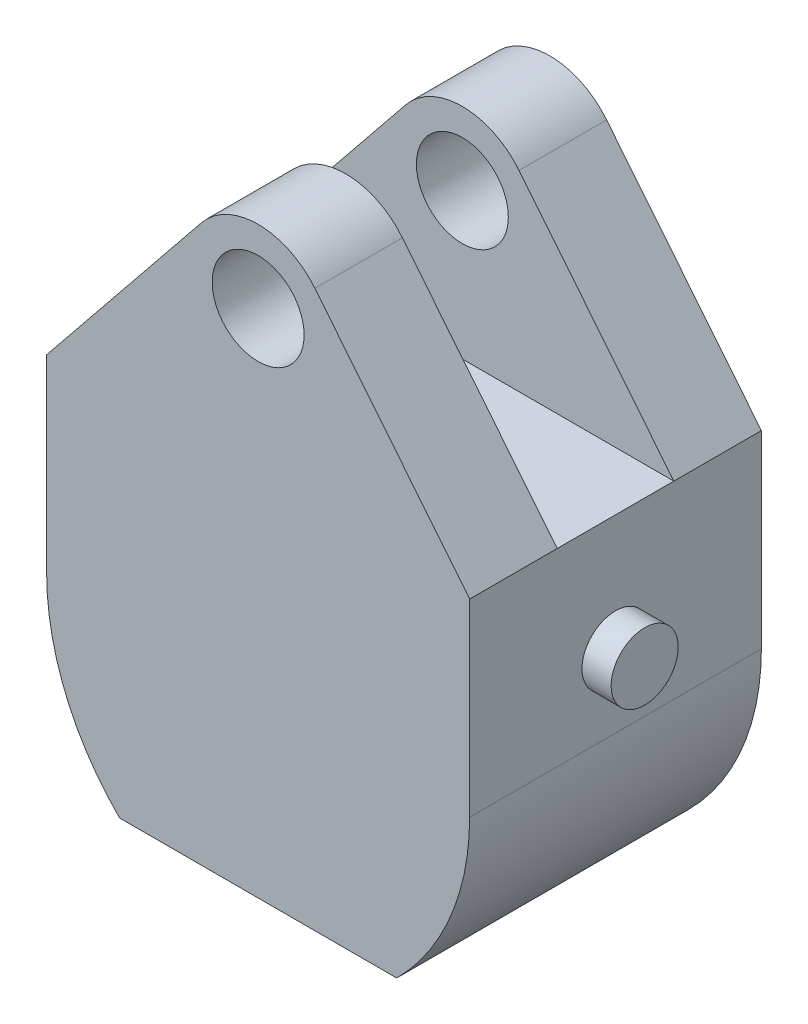
ISO-10303-21;
HEADER;
FILE_DESCRIPTION(('STEP AP214'),'2;1');
FILE_NAME('part.step','',(''),(''),'','','');
FILE_SCHEMA(('AUTOMOTIVE_DESIGN { 1 0 10303 214 1 1 1 1 }'));
ENDSEC;
DATA;
#1=APPLICATION_CONTEXT('core data for automotive mechanical design processes');
#2=APPLICATION_PROTOCOL_DEFINITION('international standard','automotive_design',2000,#1);
#3=PRODUCT_CONTEXT('',#1,'mechanical');
#4=PRODUCT('Part','Part','',(#3));
#5=PRODUCT_RELATED_PRODUCT_CATEGORY('part','',(#4));
#6=PRODUCT_DEFINITION_FORMATION('','',#4);
#7=PRODUCT_DEFINITION_CONTEXT('part definition',#1,'design');
#8=PRODUCT_DEFINITION('design','',#6,#7);
#9=PRODUCT_DEFINITION_SHAPE('','',#8);
#10=(LENGTH_UNIT() NAMED_UNIT(*) SI_UNIT(.MILLI.,.METRE.));
#11=(NAMED_UNIT(*) PLANE_ANGLE_UNIT() SI_UNIT($,.RADIAN.));
#12=(NAMED_UNIT(*) SI_UNIT($,.STERADIAN.) SOLID_ANGLE_UNIT());
#13=UNCERTAINTY_MEASURE_WITH_UNIT(LENGTH_MEASURE(1.E-05),#10,'distance_accuracy_value','');
#14=(GEOMETRIC_REPRESENTATION_CONTEXT(3) GLOBAL_UNCERTAINTY_ASSIGNED_CONTEXT((#13)) GLOBAL_UNIT_ASSIGNED_CONTEXT((#10,
#11,#12)) REPRESENTATION_CONTEXT('',''));
#15=CARTESIAN_POINT('',(0.,0.,0.));
#16=DIRECTION('',(0.,0.,1.));
#17=DIRECTION('',(1.,0.,0.));
#18=AXIS2_PLACEMENT_3D('',#15,#16,#17);
#19=CARTESIAN_POINT('',(0.,0.,20.));
#20=DIRECTION('',(0.,0.,1.));
#21=DIRECTION('',(1.,0.,0.));
#22=AXIS2_PLACEMENT_3D('',#19,#20,#21);
#23=PLANE('',#22);
#24=CARTESIAN_POINT('',(14.5,-5.,20.));
#25=DIRECTION('',(0.,0.,1.));
#26=DIRECTION('',(1.,0.,0.));
#27=AXIS2_PLACEMENT_3D('',#24,#25,#26);
#28=CIRCLE('',#27,3.15);
#29=CARTESIAN_POINT('',(17.65,-5.,20.));
#30=VERTEX_POINT('',#29);
#31=EDGE_CURVE('E338',#30,#30,#28,.T.);
#32=ORIENTED_EDGE('',*,*,#31,.F.);
#33=EDGE_LOOP('',(#32));
#34=FACE_BOUND('',#33,.T.);
#35=DIRECTION('',(0.,-1.,0.));
#36=VECTOR('',#35,1.);
#37=CARTESIAN_POINT('',(0.,0.,20.));
#38=LINE('',#37,#36);
#39=CARTESIAN_POINT('',(0.,-15.,20.));
#40=VERTEX_POINT('',#39);
#41=CARTESIAN_POINT('',(0.,-27.9583694396574,20.));
#42=VERTEX_POINT('',#41);
#43=EDGE_CURVE('E277',#40,#42,#38,.T.);
#44=ORIENTED_EDGE('',*,*,#43,.T.);
#45=CARTESIAN_POINT('',(17.,-27.9583694396574,20.));
#46=DIRECTION('',(0.,0.,1.));
#47=DIRECTION('',(1.,0.,0.));
#48=AXIS2_PLACEMENT_3D('',#45,#46,#47);
#49=CIRCLE('',#48,17.);
#50=CARTESIAN_POINT('',(4.9791847198287,-39.9791847198287,20.));
#51=VERTEX_POINT('',#50);
#52=EDGE_CURVE('E317',#42,#51,#49,.T.);
#53=ORIENTED_EDGE('',*,*,#52,.T.);
#54=DIRECTION('',(0.707106781186548,-0.707106781186547,0.));
#55=VECTOR('',#54,1.);
#56=CARTESIAN_POINT('',(-17.5,-17.5,20.));
#57=LINE('',#56,#55);
#58=CARTESIAN_POINT('',(5.00000000000002,-40.,20.));
#59=VERTEX_POINT('',#58);
#60=EDGE_CURVE('E194',#51,#59,#57,.T.);
#61=ORIENTED_EDGE('',*,*,#60,.T.);
#62=DIRECTION('',(1.,0.,0.));
#63=VECTOR('',#62,1.);
#64=CARTESIAN_POINT('',(0.,-40.,20.));
#65=LINE('',#64,#63);
#66=CARTESIAN_POINT('',(24.,-40.,20.));
#67=VERTEX_POINT('',#66);
#68=EDGE_CURVE('E280',#59,#67,#65,.T.);
#69=ORIENTED_EDGE('',*,*,#68,.T.);
#70=DIRECTION('',(-0.707106781186548,-0.707106781186547,0.));
#71=VECTOR('',#70,1.);
#72=CARTESIAN_POINT('',(32.,-32.,20.));
#73=LINE('',#72,#71);
#74=CARTESIAN_POINT('',(24.0208152801713,-39.9791847198287,20.));
#75=VERTEX_POINT('',#74);
#76=EDGE_CURVE('E210',#75,#67,#73,.T.);
#77=ORIENTED_EDGE('',*,*,#76,.F.);
#78=CARTESIAN_POINT('',(12.,-27.9583694396574,20.));
#79=DIRECTION('',(0.,0.,1.));
#80=DIRECTION('',(1.,0.,0.));
#81=AXIS2_PLACEMENT_3D('',#78,#79,#80);
#82=CIRCLE('',#81,17.);
#83=CARTESIAN_POINT('',(29.,-27.9583694396574,20.));
#84=VERTEX_POINT('',#83);
#85=EDGE_CURVE('E314',#75,#84,#82,.T.);
#86=ORIENTED_EDGE('',*,*,#85,.T.);
#87=DIRECTION('',(0.,1.,0.));
#88=VECTOR('',#87,1.);
#89=CARTESIAN_POINT('',(29.,0.,20.));
#90=LINE('',#89,#88);
#91=CARTESIAN_POINT('',(29.,-15.,20.));
#92=VERTEX_POINT('',#91);
#93=EDGE_CURVE('E285',#84,#92,#90,.T.);
#94=ORIENTED_EDGE('',*,*,#93,.T.);
#95=DIRECTION('',(-0.628188600914717,0.778061104079115,0.));
#96=VECTOR('',#95,1.);
#97=CARTESIAN_POINT('',(10.2244566227792,8.25499060074311,20.));
#98=LINE('',#97,#96);
#99=CARTESIAN_POINT('',(18.3903055203956,-1.85905699542642,20.));
#100=VERTEX_POINT('',#99);
#101=EDGE_CURVE('E179',#92,#100,#98,.T.);
#102=ORIENTED_EDGE('',*,*,#101,.T.);
#103=CARTESIAN_POINT('',(14.5,-5.,20.));
#104=DIRECTION('',(0.,0.,1.));
#105=DIRECTION('',(1.,0.,0.));
#106=AXIS2_PLACEMENT_3D('',#103,#104,#105);
#107=CIRCLE('',#106,5.);
#108=CARTESIAN_POINT('',(10.6096944796044,-1.85905699542642,20.));
#109=VERTEX_POINT('',#108);
#110=EDGE_CURVE('E172',#100,#109,#107,.T.);
#111=ORIENTED_EDGE('',*,*,#110,.T.);
#112=DIRECTION('',(0.628188600914716,0.778061104079115,0.));
#113=VECTOR('',#112,1.);
#114=CARTESIAN_POINT('',(7.33153674596428,-5.91931377478783,20.));
#115=LINE('',#114,#113);
#116=EDGE_CURVE('E176',#40,#109,#115,.T.);
#117=ORIENTED_EDGE('',*,*,#116,.F.);
#118=EDGE_LOOP('',(#44,#53,#61,#69,#77,#86,#94,#102,#111,#117));
#119=FACE_BOUND('',#118,.T.);
#120=ADVANCED_FACE('F69',(#34,#119),#23,.T.);
#121=CARTESIAN_POINT('',(0.,0.,0.));
#122=DIRECTION('',(0.,0.,1.));
#123=DIRECTION('',(1.,0.,0.));
#124=AXIS2_PLACEMENT_3D('',#121,#122,#123);
#125=PLANE('',#124);
#126=CARTESIAN_POINT('',(14.5,-5.,0.));
#127=DIRECTION('',(0.,0.,1.));
#128=DIRECTION('',(1.,0.,0.));
#129=AXIS2_PLACEMENT_3D('',#126,#127,#128);
#130=CIRCLE('',#129,3.15);
#131=CARTESIAN_POINT('',(17.65,-5.,0.));
#132=VERTEX_POINT('',#131);
#133=EDGE_CURVE('E183',#132,#132,#130,.T.);
#134=ORIENTED_EDGE('',*,*,#133,.T.);
#135=EDGE_LOOP('',(#134));
#136=FACE_BOUND('',#135,.T.);
#137=DIRECTION('',(0.707106781186548,-0.707106781186547,0.));
#138=VECTOR('',#137,1.);
#139=CARTESIAN_POINT('',(-17.5,-17.5,0.));
#140=LINE('',#139,#138);
#141=CARTESIAN_POINT('',(4.97918471982871,-39.9791847198287,0.));
#142=VERTEX_POINT('',#141);
#143=CARTESIAN_POINT('',(5.00000000000001,-40.,0.));
#144=VERTEX_POINT('',#143);
#145=EDGE_CURVE('E219',#142,#144,#140,.T.);
#146=ORIENTED_EDGE('',*,*,#145,.F.);
#147=CARTESIAN_POINT('',(17.,-27.9583694396574,0.));
#148=DIRECTION('',(0.,0.,1.));
#149=DIRECTION('',(1.,0.,0.));
#150=AXIS2_PLACEMENT_3D('',#147,#148,#149);
#151=CIRCLE('',#150,17.);
#152=CARTESIAN_POINT('',(0.,-27.9583694396574,0.));
#153=VERTEX_POINT('',#152);
#154=EDGE_CURVE('E325',#142,#153,#151,.F.);
#155=ORIENTED_EDGE('',*,*,#154,.T.);
#156=DIRECTION('',(0.,-1.,0.));
#157=VECTOR('',#156,1.);
#158=CARTESIAN_POINT('',(0.,0.,0.));
#159=LINE('',#158,#157);
#160=CARTESIAN_POINT('',(0.,-15.,0.));
#161=VERTEX_POINT('',#160);
#162=EDGE_CURVE('E276',#161,#153,#159,.T.);
#163=ORIENTED_EDGE('',*,*,#162,.F.);
#164=DIRECTION('',(0.628188600914716,0.778061104079115,0.));
#165=VECTOR('',#164,1.);
#166=CARTESIAN_POINT('',(7.33153674596428,-5.91931377478783,0.));
#167=LINE('',#166,#165);
#168=CARTESIAN_POINT('',(10.6096944796044,-1.85905699542642,0.));
#169=VERTEX_POINT('',#168);
#170=EDGE_CURVE('E215',#161,#169,#167,.T.);
#171=ORIENTED_EDGE('',*,*,#170,.T.);
#172=CARTESIAN_POINT('',(14.5,-5.,0.));
#173=DIRECTION('',(0.,0.,1.));
#174=DIRECTION('',(1.,0.,0.));
#175=AXIS2_PLACEMENT_3D('',#172,#173,#174);
#176=CIRCLE('',#175,5.);
#177=CARTESIAN_POINT('',(18.3903055203956,-1.85905699542642,0.));
#178=VERTEX_POINT('',#177);
#179=EDGE_CURVE('E257',#178,#169,#176,.T.);
#180=ORIENTED_EDGE('',*,*,#179,.F.);
#181=DIRECTION('',(-0.628188600914717,0.778061104079115,0.));
#182=VECTOR('',#181,1.);
#183=CARTESIAN_POINT('',(10.2244566227792,8.25499060074311,0.));
#184=LINE('',#183,#182);
#185=CARTESIAN_POINT('',(29.,-15.,0.));
#186=VERTEX_POINT('',#185);
#187=EDGE_CURVE('E250',#186,#178,#184,.T.);
#188=ORIENTED_EDGE('',*,*,#187,.F.);
#189=DIRECTION('',(0.,1.,0.));
#190=VECTOR('',#189,1.);
#191=CARTESIAN_POINT('',(29.,0.,0.));
#192=LINE('',#191,#190);
#193=CARTESIAN_POINT('',(29.,-27.9583694396574,0.));
#194=VERTEX_POINT('',#193);
#195=EDGE_CURVE('E281',#194,#186,#192,.T.);
#196=ORIENTED_EDGE('',*,*,#195,.F.);
#197=CARTESIAN_POINT('',(12.,-27.9583694396574,0.));
#198=DIRECTION('',(0.,0.,1.));
#199=DIRECTION('',(1.,0.,0.));
#200=AXIS2_PLACEMENT_3D('',#197,#198,#199);
#201=CIRCLE('',#200,17.);
#202=CARTESIAN_POINT('',(24.0208152801713,-39.9791847198287,0.));
#203=VERTEX_POINT('',#202);
#204=EDGE_CURVE('E86',#194,#203,#201,.F.);
#205=ORIENTED_EDGE('',*,*,#204,.T.);
#206=DIRECTION('',(-0.707106781186548,-0.707106781186547,0.));
#207=VECTOR('',#206,1.);
#208=CARTESIAN_POINT('',(32.,-32.,0.));
#209=LINE('',#208,#207);
#210=CARTESIAN_POINT('',(24.,-40.,0.));
#211=VERTEX_POINT('',#210);
#212=EDGE_CURVE('E222',#203,#211,#209,.T.);
#213=ORIENTED_EDGE('',*,*,#212,.T.);
#214=DIRECTION('',(1.,0.,0.));
#215=VECTOR('',#214,1.);
#216=CARTESIAN_POINT('',(0.,-40.,0.));
#217=LINE('',#216,#215);
#218=EDGE_CURVE('E291',#144,#211,#217,.T.);
#219=ORIENTED_EDGE('',*,*,#218,.F.);
#220=EDGE_LOOP('',(#146,#155,#163,#171,#180,#188,#196,#205,#213,#219));
#221=FACE_BOUND('',#220,.T.);
#222=ADVANCED_FACE('F361',(#136,#221),#125,.F.);
#223=CARTESIAN_POINT('',(0.,-15.,6.));
#224=DIRECTION('',(0.,0.,-1.));
#225=DIRECTION('',(-1.,0.,0.));
#226=AXIS2_PLACEMENT_3D('',#223,#224,#225);
#227=PLANE('',#226);
#228=CARTESIAN_POINT('',(14.5,-5.,6.));
#229=DIRECTION('',(0.,0.,-1.));
#230=DIRECTION('',(-1.,0.,0.));
#231=AXIS2_PLACEMENT_3D('',#228,#229,#230);
#232=CIRCLE('',#231,3.15);
#233=CARTESIAN_POINT('',(11.35,-5.,6.));
#234=VERTEX_POINT('',#233);
#235=EDGE_CURVE('E226',#234,#234,#232,.T.);
#236=ORIENTED_EDGE('',*,*,#235,.T.);
#237=EDGE_LOOP('',(#236));
#238=FACE_BOUND('',#237,.T.);
#239=CARTESIAN_POINT('',(14.5,-5.,6.));
#240=DIRECTION('',(0.,0.,-1.));
#241=DIRECTION('',(-1.,0.,0.));
#242=AXIS2_PLACEMENT_3D('',#239,#240,#241);
#243=CIRCLE('',#242,5.);
#244=CARTESIAN_POINT('',(10.6096944796044,-1.85905699542642,6.));
#245=VERTEX_POINT('',#244);
#246=CARTESIAN_POINT('',(18.3903055203956,-1.85905699542642,6.));
#247=VERTEX_POINT('',#246);
#248=EDGE_CURVE('E253',#245,#247,#243,.T.);
#249=ORIENTED_EDGE('',*,*,#248,.F.);
#250=DIRECTION('',(-0.628188600914716,-0.778061104079115,0.));
#251=VECTOR('',#250,1.);
#252=CARTESIAN_POINT('',(0.,-15.,6.));
#253=LINE('',#252,#251);
#254=CARTESIAN_POINT('',(0.,-15.,6.));
#255=VERTEX_POINT('',#254);
#256=EDGE_CURVE('E205',#245,#255,#253,.T.);
#257=ORIENTED_EDGE('',*,*,#256,.T.);
#258=DIRECTION('',(-1.,0.,0.));
#259=VECTOR('',#258,1.);
#260=CARTESIAN_POINT('',(0.,-15.,6.));
#261=LINE('',#260,#259);
#262=CARTESIAN_POINT('',(29.,-15.,6.));
#263=VERTEX_POINT('',#262);
#264=EDGE_CURVE('E272',#263,#255,#261,.T.);
#265=ORIENTED_EDGE('',*,*,#264,.F.);
#266=DIRECTION('',(0.628188600914717,-0.778061104079115,0.));
#267=VECTOR('',#266,1.);
#268=CARTESIAN_POINT('',(17.5559933687435,-0.825695624469056,6.));
#269=LINE('',#268,#267);
#270=EDGE_CURVE('E247',#247,#263,#269,.T.);
#271=ORIENTED_EDGE('',*,*,#270,.F.);
#272=EDGE_LOOP('',(#249,#257,#265,#271));
#273=FACE_BOUND('',#272,.T.);
#274=ADVANCED_FACE('F397',(#238,#273),#227,.F.);
#275=CARTESIAN_POINT('',(0.,-15.,14.));
#276=DIRECTION('',(0.,0.,1.));
#277=DIRECTION('',(1.,0.,0.));
#278=AXIS2_PLACEMENT_3D('',#275,#276,#277);
#279=PLANE('',#278);
#280=CARTESIAN_POINT('',(14.5,-5.,14.));
#281=DIRECTION('',(0.,0.,1.));
#282=DIRECTION('',(1.,0.,0.));
#283=AXIS2_PLACEMENT_3D('',#280,#281,#282);
#284=CIRCLE('',#283,3.15);
#285=CARTESIAN_POINT('',(17.65,-5.,14.));
#286=VERTEX_POINT('',#285);
#287=EDGE_CURVE('E225',#286,#286,#284,.T.);
#288=ORIENTED_EDGE('',*,*,#287,.T.);
#289=EDGE_LOOP('',(#288));
#290=FACE_BOUND('',#289,.T.);
#291=DIRECTION('',(0.628188600914716,0.778061104079115,0.));
#292=VECTOR('',#291,1.);
#293=CARTESIAN_POINT('',(0.,-15.,14.));
#294=LINE('',#293,#292);
#295=CARTESIAN_POINT('',(0.,-15.,14.));
#296=VERTEX_POINT('',#295);
#297=CARTESIAN_POINT('',(10.6096944796044,-1.85905699542642,14.));
#298=VERTEX_POINT('',#297);
#299=EDGE_CURVE('E200',#296,#298,#294,.T.);
#300=ORIENTED_EDGE('',*,*,#299,.T.);
#301=CARTESIAN_POINT('',(14.5,-5.,14.));
#302=DIRECTION('',(0.,0.,1.));
#303=DIRECTION('',(1.,0.,0.));
#304=AXIS2_PLACEMENT_3D('',#301,#302,#303);
#305=CIRCLE('',#304,5.);
#306=CARTESIAN_POINT('',(18.3903055203956,-1.85905699542642,14.));
#307=VERTEX_POINT('',#306);
#308=EDGE_CURVE('E189',#307,#298,#305,.T.);
#309=ORIENTED_EDGE('',*,*,#308,.F.);
#310=DIRECTION('',(-0.628188600914717,0.778061104079115,0.));
#311=VECTOR('',#310,1.);
#312=CARTESIAN_POINT('',(17.5559933687435,-0.825695624469056,14.));
#313=LINE('',#312,#311);
#314=CARTESIAN_POINT('',(29.,-15.,14.));
#315=VERTEX_POINT('',#314);
#316=EDGE_CURVE('E244',#315,#307,#313,.T.);
#317=ORIENTED_EDGE('',*,*,#316,.F.);
#318=DIRECTION('',(1.,0.,0.));
#319=VECTOR('',#318,1.);
#320=CARTESIAN_POINT('',(0.,-15.,14.));
#321=LINE('',#320,#319);
#322=EDGE_CURVE('E264',#296,#315,#321,.T.);
#323=ORIENTED_EDGE('',*,*,#322,.F.);
#324=EDGE_LOOP('',(#300,#309,#317,#323));
#325=FACE_BOUND('',#324,.T.);
#326=ADVANCED_FACE('F388',(#290,#325),#279,.F.);
#327=CARTESIAN_POINT('',(0.,0.,20.));
#328=DIRECTION('',(1.,0.,0.));
#329=DIRECTION('',(0.,1.,0.));
#330=AXIS2_PLACEMENT_3D('',#327,#328,#329);
#331=PLANE('',#330);
#332=CARTESIAN_POINT('',(0.,-23.,10.));
#333=DIRECTION('',(1.,0.,0.));
#334=DIRECTION('',(0.,1.,0.));
#335=AXIS2_PLACEMENT_3D('',#332,#333,#334);
#336=CIRCLE('',#335,2.3);
#337=CARTESIAN_POINT('',(0.,-20.7,10.));
#338=VERTEX_POINT('',#337);
#339=EDGE_CURVE('E342',#338,#338,#336,.T.);
#340=ORIENTED_EDGE('',*,*,#339,.T.);
#341=EDGE_LOOP('',(#340));
#342=FACE_BOUND('',#341,.T.);
#343=ORIENTED_EDGE('',*,*,#162,.T.);
#344=DIRECTION('',(0.,0.,1.));
#345=VECTOR('',#344,1.);
#346=CARTESIAN_POINT('',(0.,-27.9583694396574,20.));
#347=LINE('',#346,#345);
#348=EDGE_CURVE('E307',#153,#42,#347,.T.);
#349=ORIENTED_EDGE('',*,*,#348,.T.);
#350=ORIENTED_EDGE('',*,*,#43,.F.);
#351=DIRECTION('',(0.,0.,1.));
#352=VECTOR('',#351,1.);
#353=CARTESIAN_POINT('',(0.,-15.,-10.));
#354=LINE('',#353,#352);
#355=EDGE_CURVE('E198',#296,#40,#354,.T.);
#356=ORIENTED_EDGE('',*,*,#355,.F.);
#357=DIRECTION('',(0.,0.,1.));
#358=VECTOR('',#357,1.);
#359=CARTESIAN_POINT('',(0.,-15.,6.));
#360=LINE('',#359,#358);
#361=EDGE_CURVE('E260',#255,#296,#360,.T.);
#362=ORIENTED_EDGE('',*,*,#361,.F.);
#363=EDGE_CURVE('E201',#161,#255,#354,.T.);
#364=ORIENTED_EDGE('',*,*,#363,.F.);
#365=EDGE_LOOP('',(#343,#349,#350,#356,#362,#364));
#366=FACE_BOUND('',#365,.T.);
#367=ADVANCED_FACE('F366',(#342,#366),#331,.F.);
#368=CARTESIAN_POINT('',(0.,-40.,20.));
#369=DIRECTION('',(0.,1.,0.));
#370=DIRECTION('',(0.,0.,1.));
#371=AXIS2_PLACEMENT_3D('',#368,#369,#370);
#372=PLANE('',#371);
#373=ORIENTED_EDGE('',*,*,#218,.T.);
#374=DIRECTION('',(0.,0.,1.));
#375=VECTOR('',#374,1.);
#376=CARTESIAN_POINT('',(24.,-40.,20.));
#377=LINE('',#376,#375);
#378=EDGE_CURVE('E303',#211,#67,#377,.T.);
#379=ORIENTED_EDGE('',*,*,#378,.T.);
#380=ORIENTED_EDGE('',*,*,#68,.F.);
#381=DIRECTION('',(0.,0.,1.));
#382=VECTOR('',#381,1.);
#383=CARTESIAN_POINT('',(5.00000000000001,-40.,20.));
#384=LINE('',#383,#382);
#385=EDGE_CURVE('E299',#144,#59,#384,.T.);
#386=ORIENTED_EDGE('',*,*,#385,.F.);
#387=EDGE_LOOP('',(#373,#379,#380,#386));
#388=FACE_BOUND('',#387,.T.);
#389=ADVANCED_FACE('F377',(#388),#372,.F.);
#390=CARTESIAN_POINT('',(29.,0.,20.));
#391=DIRECTION('',(-1.,0.,0.));
#392=DIRECTION('',(0.,-1.,0.));
#393=AXIS2_PLACEMENT_3D('',#390,#391,#392);
#394=PLANE('',#393);
#395=CARTESIAN_POINT('',(29.,-23.,10.));
#396=DIRECTION('',(-1.,0.,0.));
#397=DIRECTION('',(0.,-1.,0.));
#398=AXIS2_PLACEMENT_3D('',#395,#396,#397);
#399=CIRCLE('',#398,2.3);
#400=CARTESIAN_POINT('',(29.,-25.3,10.));
#401=VERTEX_POINT('',#400);
#402=EDGE_CURVE('E73',#401,#401,#399,.T.);
#403=ORIENTED_EDGE('',*,*,#402,.T.);
#404=EDGE_LOOP('',(#403));
#405=FACE_BOUND('',#404,.T.);
#406=ORIENTED_EDGE('',*,*,#93,.F.);
#407=DIRECTION('',(0.,0.,1.));
#408=VECTOR('',#407,1.);
#409=CARTESIAN_POINT('',(29.,-27.9583694396574,20.));
#410=LINE('',#409,#408);
#411=EDGE_CURVE('E12',#84,#194,#410,.F.);
#412=ORIENTED_EDGE('',*,*,#411,.T.);
#413=ORIENTED_EDGE('',*,*,#195,.T.);
#414=DIRECTION('',(0.,0.,1.));
#415=VECTOR('',#414,1.);
#416=CARTESIAN_POINT('',(29.,-15.,-10.));
#417=LINE('',#416,#415);
#418=EDGE_CURVE('E240',#186,#263,#417,.T.);
#419=ORIENTED_EDGE('',*,*,#418,.T.);
#420=DIRECTION('',(0.,0.,-1.));
#421=VECTOR('',#420,1.);
#422=CARTESIAN_POINT('',(29.,-15.,6.));
#423=LINE('',#422,#421);
#424=EDGE_CURVE('E268',#315,#263,#423,.T.);
#425=ORIENTED_EDGE('',*,*,#424,.F.);
#426=EDGE_CURVE('E236',#315,#92,#417,.T.);
#427=ORIENTED_EDGE('',*,*,#426,.T.);
#428=EDGE_LOOP('',(#406,#412,#413,#419,#425,#427));
#429=FACE_BOUND('',#428,.T.);
#430=ADVANCED_FACE('F379',(#405,#429),#394,.F.);
#431=CARTESIAN_POINT('',(0.,-15.,0.));
#432=DIRECTION('',(0.,1.,0.));
#433=DIRECTION('',(0.,0.,1.));
#434=AXIS2_PLACEMENT_3D('',#431,#432,#433);
#435=PLANE('',#434);
#436=ORIENTED_EDGE('',*,*,#361,.T.);
#437=ORIENTED_EDGE('',*,*,#322,.T.);
#438=ORIENTED_EDGE('',*,*,#424,.T.);
#439=ORIENTED_EDGE('',*,*,#264,.T.);
#440=EDGE_LOOP('',(#436,#437,#438,#439));
#441=FACE_BOUND('',#440,.T.);
#442=ADVANCED_FACE('F385',(#441),#435,.T.);
#443=CARTESIAN_POINT('',(10.2244566227792,8.25499060074311,-10.));
#444=DIRECTION('',(0.778061104079115,0.628188600914717,0.));
#445=DIRECTION('',(-0.628188600914717,0.778061104079115,0.));
#446=AXIS2_PLACEMENT_3D('',#443,#444,#445);
#447=PLANE('',#446);
#448=ORIENTED_EDGE('',*,*,#316,.T.);
#449=DIRECTION('',(0.,0.,1.));
#450=VECTOR('',#449,1.);
#451=CARTESIAN_POINT('',(18.3903055203956,-1.85905699542642,-10.));
#452=LINE('',#451,#450);
#453=EDGE_CURVE('E235',#307,#100,#452,.T.);
#454=ORIENTED_EDGE('',*,*,#453,.T.);
#455=ORIENTED_EDGE('',*,*,#101,.F.);
#456=ORIENTED_EDGE('',*,*,#426,.F.);
#457=EDGE_LOOP('',(#448,#454,#455,#456));
#458=FACE_BOUND('',#457,.T.);
#459=ADVANCED_FACE('F410',(#458),#447,.T.);
#460=CARTESIAN_POINT('',(14.5,-5.,-10.));
#461=DIRECTION('',(0.,0.,1.));
#462=DIRECTION('',(1.,0.,0.));
#463=AXIS2_PLACEMENT_3D('',#460,#461,#462);
#464=CYLINDRICAL_SURFACE('',#463,5.);
#465=ORIENTED_EDGE('',*,*,#308,.T.);
#466=DIRECTION('',(0.,0.,1.));
#467=VECTOR('',#466,1.);
#468=CARTESIAN_POINT('',(10.6096944796044,-1.85905699542642,-10.));
#469=LINE('',#468,#467);
#470=EDGE_CURVE('E186',#298,#109,#469,.T.);
#471=ORIENTED_EDGE('',*,*,#470,.T.);
#472=ORIENTED_EDGE('',*,*,#110,.F.);
#473=ORIENTED_EDGE('',*,*,#453,.F.);
#474=EDGE_LOOP('',(#465,#471,#472,#473));
#475=FACE_BOUND('',#474,.T.);
#476=ADVANCED_FACE('F187',(#475),#464,.T.);
#477=ORIENTED_EDGE('',*,*,#179,.T.);
#478=EDGE_CURVE('E193',#169,#245,#469,.T.);
#479=ORIENTED_EDGE('',*,*,#478,.T.);
#480=ORIENTED_EDGE('',*,*,#248,.T.);
#481=EDGE_CURVE('E241',#178,#247,#452,.T.);
#482=ORIENTED_EDGE('',*,*,#481,.F.);
#483=EDGE_LOOP('',(#477,#479,#480,#482));
#484=FACE_BOUND('',#483,.T.);
#485=ADVANCED_FACE('F351',(#484),#464,.T.);
#486=ORIENTED_EDGE('',*,*,#187,.T.);
#487=ORIENTED_EDGE('',*,*,#481,.T.);
#488=ORIENTED_EDGE('',*,*,#270,.T.);
#489=ORIENTED_EDGE('',*,*,#418,.F.);
#490=EDGE_LOOP('',(#486,#487,#488,#489));
#491=FACE_BOUND('',#490,.T.);
#492=ADVANCED_FACE('F414',(#491),#447,.T.);
#493=CARTESIAN_POINT('',(7.33153674596428,-5.91931377478783,-10.));
#494=DIRECTION('',(0.778061104079115,-0.628188600914716,0.));
#495=DIRECTION('',(0.628188600914716,0.778061104079115,0.));
#496=AXIS2_PLACEMENT_3D('',#493,#494,#495);
#497=PLANE('',#496);
#498=ORIENTED_EDGE('',*,*,#363,.T.);
#499=ORIENTED_EDGE('',*,*,#256,.F.);
#500=ORIENTED_EDGE('',*,*,#478,.F.);
#501=ORIENTED_EDGE('',*,*,#170,.F.);
#502=EDGE_LOOP('',(#498,#499,#500,#501));
#503=FACE_BOUND('',#502,.T.);
#504=ADVANCED_FACE('F357',(#503),#497,.F.);
#505=ORIENTED_EDGE('',*,*,#355,.T.);
#506=ORIENTED_EDGE('',*,*,#116,.T.);
#507=ORIENTED_EDGE('',*,*,#470,.F.);
#508=ORIENTED_EDGE('',*,*,#299,.F.);
#509=EDGE_LOOP('',(#505,#506,#507,#508));
#510=FACE_BOUND('',#509,.T.);
#511=ADVANCED_FACE('F196',(#510),#497,.F.);
#512=CARTESIAN_POINT('',(-17.5,-17.5,-10.));
#513=DIRECTION('',(-0.707106781186547,-0.707106781186548,0.));
#514=DIRECTION('',(0.707106781186548,-0.707106781186547,0.));
#515=AXIS2_PLACEMENT_3D('',#512,#513,#514);
#516=PLANE('',#515);
#517=ORIENTED_EDGE('',*,*,#60,.F.);
#518=DIRECTION('',(0.,0.,1.));
#519=VECTOR('',#518,1.);
#520=CARTESIAN_POINT('',(4.9791847198287,-39.9791847198287,0.));
#521=LINE('',#520,#519);
#522=EDGE_CURVE('E320',#51,#142,#521,.F.);
#523=ORIENTED_EDGE('',*,*,#522,.T.);
#524=ORIENTED_EDGE('',*,*,#145,.T.);
#525=ORIENTED_EDGE('',*,*,#385,.T.);
#526=EDGE_LOOP('',(#517,#523,#524,#525));
#527=FACE_BOUND('',#526,.T.);
#528=ADVANCED_FACE('F373',(#527),#516,.T.);
#529=CARTESIAN_POINT('',(32.,-32.,-10.));
#530=DIRECTION('',(-0.707106781186547,0.707106781186548,0.));
#531=DIRECTION('',(-0.707106781186548,-0.707106781186547,0.));
#532=AXIS2_PLACEMENT_3D('',#529,#530,#531);
#533=PLANE('',#532);
#534=ORIENTED_EDGE('',*,*,#212,.F.);
#535=DIRECTION('',(0.,0.,1.));
#536=VECTOR('',#535,1.);
#537=CARTESIAN_POINT('',(24.0208152801713,-39.9791847198287,-10.));
#538=LINE('',#537,#536);
#539=EDGE_CURVE('E79',#203,#75,#538,.T.);
#540=ORIENTED_EDGE('',*,*,#539,.T.);
#541=ORIENTED_EDGE('',*,*,#76,.T.);
#542=ORIENTED_EDGE('',*,*,#378,.F.);
#543=EDGE_LOOP('',(#534,#540,#541,#542));
#544=FACE_BOUND('',#543,.T.);
#545=ADVANCED_FACE('F333',(#544),#533,.F.);
#546=CARTESIAN_POINT('',(14.5,-5.,-10.));
#547=DIRECTION('',(0.,0.,1.));
#548=DIRECTION('',(1.,0.,0.));
#549=AXIS2_PLACEMENT_3D('',#546,#547,#548);
#550=CYLINDRICAL_SURFACE('',#549,3.15);
#551=ORIENTED_EDGE('',*,*,#31,.T.);
#552=EDGE_LOOP('',(#551));
#553=FACE_BOUND('',#552,.T.);
#554=ORIENTED_EDGE('',*,*,#287,.F.);
#555=EDGE_LOOP('',(#554));
#556=FACE_BOUND('',#555,.T.);
#557=ADVANCED_FACE('F425',(#553,#556),#550,.F.);
#558=ORIENTED_EDGE('',*,*,#235,.F.);
#559=EDGE_LOOP('',(#558));
#560=FACE_BOUND('',#559,.T.);
#561=ORIENTED_EDGE('',*,*,#133,.F.);
#562=EDGE_LOOP('',(#561));
#563=FACE_BOUND('',#562,.T.);
#564=ADVANCED_FACE('F422',(#560,#563),#550,.F.);
#565=CARTESIAN_POINT('',(17.,-27.9583694396574,20.));
#566=DIRECTION('',(0.,0.,-1.));
#567=DIRECTION('',(-1.,0.,0.));
#568=AXIS2_PLACEMENT_3D('',#565,#566,#567);
#569=CYLINDRICAL_SURFACE('',#568,17.);
#570=ORIENTED_EDGE('',*,*,#154,.F.);
#571=ORIENTED_EDGE('',*,*,#522,.F.);
#572=ORIENTED_EDGE('',*,*,#52,.F.);
#573=ORIENTED_EDGE('',*,*,#348,.F.);
#574=EDGE_LOOP('',(#570,#571,#572,#573));
#575=FACE_BOUND('',#574,.T.);
#576=ADVANCED_FACE('F369',(#575),#569,.T.);
#577=CARTESIAN_POINT('',(12.,-27.9583694396574,-10.));
#578=DIRECTION('',(0.,0.,1.));
#579=DIRECTION('',(1.,0.,0.));
#580=AXIS2_PLACEMENT_3D('',#577,#578,#579);
#581=CYLINDRICAL_SURFACE('',#580,17.);
#582=ORIENTED_EDGE('',*,*,#204,.F.);
#583=ORIENTED_EDGE('',*,*,#411,.F.);
#584=ORIENTED_EDGE('',*,*,#85,.F.);
#585=ORIENTED_EDGE('',*,*,#539,.F.);
#586=EDGE_LOOP('',(#582,#583,#584,#585));
#587=FACE_BOUND('',#586,.T.);
#588=ADVANCED_FACE('F71',(#587),#581,.T.);
#589=CARTESIAN_POINT('',(31.,-23.,10.));
#590=DIRECTION('',(1.,0.,0.));
#591=DIRECTION('',(0.,1.,0.));
#592=AXIS2_PLACEMENT_3D('',#589,#590,#591);
#593=PLANE('',#592);
#594=CARTESIAN_POINT('',(31.,-23.,10.));
#595=DIRECTION('',(1.,0.,0.));
#596=DIRECTION('',(0.,1.,0.));
#597=AXIS2_PLACEMENT_3D('',#594,#595,#596);
#598=CIRCLE('',#597,2.3);
#599=CARTESIAN_POINT('',(31.,-20.7,10.));
#600=VERTEX_POINT('',#599);
#601=EDGE_CURVE('E448',#600,#600,#598,.T.);
#602=ORIENTED_EDGE('',*,*,#601,.T.);
#603=EDGE_LOOP('',(#602));
#604=FACE_BOUND('',#603,.T.);
#605=ADVANCED_FACE('F438',(#604),#593,.T.);
#606=CARTESIAN_POINT('',(-3.,-23.,10.));
#607=DIRECTION('',(1.,0.,0.));
#608=DIRECTION('',(0.,1.,0.));
#609=AXIS2_PLACEMENT_3D('',#606,#607,#608);
#610=CYLINDRICAL_SURFACE('',#609,2.3);
#611=ORIENTED_EDGE('',*,*,#601,.F.);
#612=EDGE_LOOP('',(#611));
#613=FACE_BOUND('',#612,.T.);
#614=ORIENTED_EDGE('',*,*,#402,.F.);
#615=EDGE_LOOP('',(#614));
#616=FACE_BOUND('',#615,.T.);
#617=ADVANCED_FACE('F433',(#613,#616),#610,.T.);
#618=CARTESIAN_POINT('',(-3.,-23.,10.));
#619=DIRECTION('',(1.,0.,0.));
#620=DIRECTION('',(0.,1.,0.));
#621=AXIS2_PLACEMENT_3D('',#618,#619,#620);
#622=CIRCLE('',#621,2.3);
#623=CARTESIAN_POINT('',(-3.,-20.7,10.));
#624=VERTEX_POINT('',#623);
#625=EDGE_CURVE('E450',#624,#624,#622,.T.);
#626=ORIENTED_EDGE('',*,*,#625,.T.);
#627=EDGE_LOOP('',(#626));
#628=FACE_BOUND('',#627,.T.);
#629=ORIENTED_EDGE('',*,*,#339,.F.);
#630=EDGE_LOOP('',(#629));
#631=FACE_BOUND('',#630,.T.);
#632=ADVANCED_FACE('F429',(#628,#631),#610,.T.);
#633=CARTESIAN_POINT('',(-3.,-23.,10.));
#634=DIRECTION('',(1.,0.,0.));
#635=DIRECTION('',(0.,1.,0.));
#636=AXIS2_PLACEMENT_3D('',#633,#634,#635);
#637=PLANE('',#636);
#638=ORIENTED_EDGE('',*,*,#625,.F.);
#639=EDGE_LOOP('',(#638));
#640=FACE_BOUND('',#639,.T.);
#641=ADVANCED_FACE('F432',(#640),#637,.F.);
#642=CLOSED_SHELL('',(#120,#222,#274,#326,#367,#389,#430,#442,#459,#476,#485,#492,#504,#511,
#528,#545,#557,#564,#576,#588,#605,#617,#632,#641));
#643=MANIFOLD_SOLID_BREP('B2',#642);
#644=ADVANCED_BREP_SHAPE_REPRESENTATION('',(#18,#643),#14);
#645=SHAPE_DEFINITION_REPRESENTATION(#9,#644);
ENDSEC;
END-ISO-10303-21;
